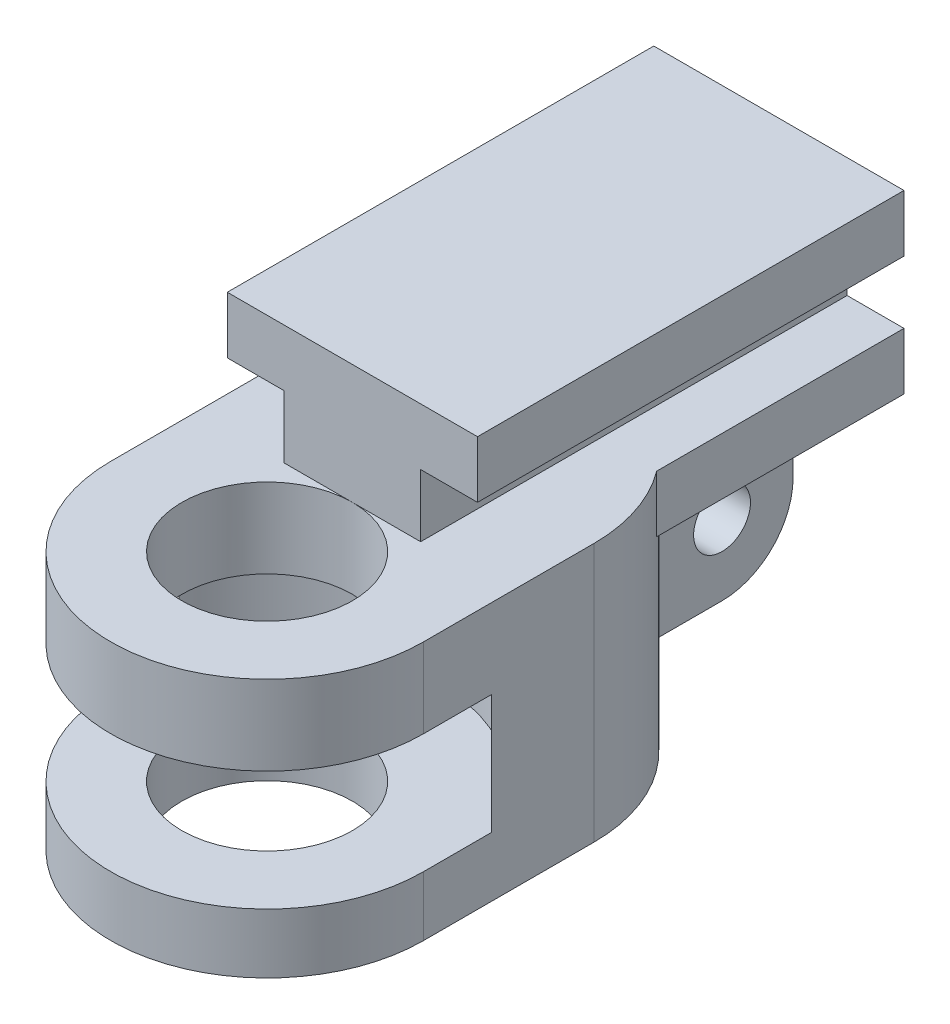
ISO-10303-21;
HEADER;
FILE_DESCRIPTION(('STEP AP214'),'2;1');
FILE_NAME('part.step','',(''),(''),'','','');
FILE_SCHEMA(('AUTOMOTIVE_DESIGN { 1 0 10303 214 1 1 1 1 }'));
ENDSEC;
DATA;
#1=APPLICATION_CONTEXT('core data for automotive mechanical design processes');
#2=APPLICATION_PROTOCOL_DEFINITION('international standard','automotive_design',2000,#1);
#3=PRODUCT_CONTEXT('',#1,'mechanical');
#4=PRODUCT('Part','Part','',(#3));
#5=PRODUCT_RELATED_PRODUCT_CATEGORY('part','',(#4));
#6=PRODUCT_DEFINITION_FORMATION('','',#4);
#7=PRODUCT_DEFINITION_CONTEXT('part definition',#1,'design');
#8=PRODUCT_DEFINITION('design','',#6,#7);
#9=PRODUCT_DEFINITION_SHAPE('','',#8);
#10=(LENGTH_UNIT() NAMED_UNIT(*) SI_UNIT(.MILLI.,.METRE.));
#11=(NAMED_UNIT(*) PLANE_ANGLE_UNIT() SI_UNIT($,.RADIAN.));
#12=(NAMED_UNIT(*) SI_UNIT($,.STERADIAN.) SOLID_ANGLE_UNIT());
#13=UNCERTAINTY_MEASURE_WITH_UNIT(LENGTH_MEASURE(1.E-05),#10,'distance_accuracy_value','');
#14=(GEOMETRIC_REPRESENTATION_CONTEXT(3) GLOBAL_UNCERTAINTY_ASSIGNED_CONTEXT((#13)) GLOBAL_UNIT_ASSIGNED_CONTEXT((#10,
#11,#12)) REPRESENTATION_CONTEXT('',''));
#15=CARTESIAN_POINT('',(0.,0.,0.));
#16=DIRECTION('',(0.,0.,1.));
#17=DIRECTION('',(1.,0.,0.));
#18=AXIS2_PLACEMENT_3D('',#15,#16,#17);
#19=CARTESIAN_POINT('',(-4.4,-3.1,15.));
#20=DIRECTION('',(0.,1.,0.));
#21=DIRECTION('',(0.,0.,1.));
#22=AXIS2_PLACEMENT_3D('',#19,#20,#21);
#23=PLANE('',#22);
#24=DIRECTION('',(0.,0.,1.));
#25=VECTOR('',#24,1.);
#26=CARTESIAN_POINT('',(-1.5,-3.1,9.5));
#27=LINE('',#26,#25);
#28=CARTESIAN_POINT('',(-1.5,-3.1,0.999999999999999));
#29=VERTEX_POINT('',#28);
#30=CARTESIAN_POINT('',(-1.5,-3.1,6.70849737787082));
#31=VERTEX_POINT('',#30);
#32=EDGE_CURVE('E245',#29,#31,#27,.T.);
#33=ORIENTED_EDGE('',*,*,#32,.T.);
#34=CARTESIAN_POINT('',(0.,-3.1,12.));
#35=DIRECTION('',(0.,1.,0.));
#36=DIRECTION('',(0.,0.,1.));
#37=AXIS2_PLACEMENT_3D('',#34,#35,#36);
#38=CIRCLE('',#37,5.5);
#39=CARTESIAN_POINT('',(-4.4,-3.1,8.7));
#40=VERTEX_POINT('',#39);
#41=EDGE_CURVE('E322',#31,#40,#38,.T.);
#42=ORIENTED_EDGE('',*,*,#41,.T.);
#43=DIRECTION('',(0.,0.,-1.));
#44=VECTOR('',#43,1.);
#45=CARTESIAN_POINT('',(-4.4,-3.1,15.));
#46=LINE('',#45,#44);
#47=CARTESIAN_POINT('',(-4.4,-3.1,0.));
#48=VERTEX_POINT('',#47);
#49=EDGE_CURVE('E385',#40,#48,#46,.T.);
#50=ORIENTED_EDGE('',*,*,#49,.T.);
#51=DIRECTION('',(1.,0.,0.));
#52=VECTOR('',#51,1.);
#53=CARTESIAN_POINT('',(-4.4,-3.1,0.));
#54=LINE('',#53,#52);
#55=CARTESIAN_POINT('',(4.4,-3.1,0.));
#56=VERTEX_POINT('',#55);
#57=EDGE_CURVE('E362',#48,#56,#54,.T.);
#58=ORIENTED_EDGE('',*,*,#57,.T.);
#59=DIRECTION('',(0.,0.,-1.));
#60=VECTOR('',#59,1.);
#61=CARTESIAN_POINT('',(4.4,-3.1,15.));
#62=LINE('',#61,#60);
#63=CARTESIAN_POINT('',(4.4,-3.1,8.7));
#64=VERTEX_POINT('',#63);
#65=EDGE_CURVE('E383',#64,#56,#62,.T.);
#66=ORIENTED_EDGE('',*,*,#65,.F.);
#67=CARTESIAN_POINT('',(1.5,-3.1,6.70849737787082));
#68=VERTEX_POINT('',#67);
#69=EDGE_CURVE('E323',#64,#68,#38,.T.);
#70=ORIENTED_EDGE('',*,*,#69,.T.);
#71=DIRECTION('',(0.,0.,1.));
#72=VECTOR('',#71,1.);
#73=CARTESIAN_POINT('',(1.5,-3.1,9.5));
#74=LINE('',#73,#72);
#75=CARTESIAN_POINT('',(1.5,-3.1,0.999999999999997));
#76=VERTEX_POINT('',#75);
#77=EDGE_CURVE('E60',#76,#68,#74,.T.);
#78=ORIENTED_EDGE('',*,*,#77,.F.);
#79=DIRECTION('',(1.,0.,0.));
#80=VECTOR('',#79,1.);
#81=CARTESIAN_POINT('',(-1.5,-3.1,0.999999999999999));
#82=LINE('',#81,#80);
#83=EDGE_CURVE('E55',#29,#76,#82,.T.);
#84=ORIENTED_EDGE('',*,*,#83,.F.);
#85=EDGE_LOOP('',(#33,#42,#50,#58,#66,#70,#78,#84));
#86=FACE_BOUND('',#85,.T.);
#87=ADVANCED_FACE('F40',(#86),#23,.F.);
#88=CARTESIAN_POINT('',(0.,-10.2,12.));
#89=DIRECTION('',(0.,1.,0.));
#90=DIRECTION('',(-1.,0.,0.));
#91=AXIS2_PLACEMENT_3D('',#88,#89,#90);
#92=CYLINDRICAL_SURFACE('',#91,5.5);
#93=ORIENTED_EDGE('',*,*,#41,.F.);
#94=DIRECTION('',(0.,1.,0.));
#95=VECTOR('',#94,1.);
#96=CARTESIAN_POINT('',(-1.5,-10.2,6.70849737787082));
#97=LINE('',#96,#95);
#98=CARTESIAN_POINT('',(-1.5,-9.1,6.70849737787082));
#99=VERTEX_POINT('',#98);
#100=EDGE_CURVE('E11',#31,#99,#97,.F.);
#101=ORIENTED_EDGE('',*,*,#100,.T.);
#102=CARTESIAN_POINT('',(0.,-9.1,12.));
#103=DIRECTION('',(0.,-1.,0.));
#104=DIRECTION('',(0.,0.,-1.));
#105=AXIS2_PLACEMENT_3D('',#102,#103,#104);
#106=CIRCLE('',#105,5.5);
#107=CARTESIAN_POINT('',(1.5,-9.1,6.70849737787082));
#108=VERTEX_POINT('',#107);
#109=EDGE_CURVE('E48',#108,#99,#106,.F.);
#110=ORIENTED_EDGE('',*,*,#109,.F.);
#111=DIRECTION('',(0.,1.,0.));
#112=VECTOR('',#111,1.);
#113=CARTESIAN_POINT('',(1.5,-10.2,6.70849737787082));
#114=LINE('',#113,#112);
#115=EDGE_CURVE('E414',#68,#108,#114,.F.);
#116=ORIENTED_EDGE('',*,*,#115,.F.);
#117=ORIENTED_EDGE('',*,*,#69,.F.);
#118=DIRECTION('',(0.,1.,0.));
#119=VECTOR('',#118,1.);
#120=CARTESIAN_POINT('',(4.4,-10.2,8.7));
#121=LINE('',#120,#119);
#122=CARTESIAN_POINT('',(4.4,-1.1,8.7));
#123=VERTEX_POINT('',#122);
#124=EDGE_CURVE('E310',#123,#64,#121,.F.);
#125=ORIENTED_EDGE('',*,*,#124,.F.);
#126=CARTESIAN_POINT('',(0.,-1.1,12.));
#127=DIRECTION('',(0.,1.,0.));
#128=DIRECTION('',(-1.,0.,0.));
#129=AXIS2_PLACEMENT_3D('',#126,#127,#128);
#130=CIRCLE('',#129,5.5);
#131=CARTESIAN_POINT('',(5.5,-1.1,12.));
#132=VERTEX_POINT('',#131);
#133=EDGE_CURVE('E297',#132,#123,#130,.T.);
#134=ORIENTED_EDGE('',*,*,#133,.F.);
#135=DIRECTION('',(0.,1.,0.));
#136=VECTOR('',#135,1.);
#137=CARTESIAN_POINT('',(5.5,-10.2,12.));
#138=LINE('',#137,#136);
#139=CARTESIAN_POINT('',(5.5,-10.2,12.));
#140=VERTEX_POINT('',#139);
#141=EDGE_CURVE('E308',#140,#132,#138,.T.);
#142=ORIENTED_EDGE('',*,*,#141,.F.);
#143=CARTESIAN_POINT('',(0.,-10.2,12.));
#144=DIRECTION('',(0.,1.,0.));
#145=DIRECTION('',(-1.,0.,0.));
#146=AXIS2_PLACEMENT_3D('',#143,#144,#145);
#147=CIRCLE('',#146,5.5);
#148=CARTESIAN_POINT('',(-5.5,-10.2,12.));
#149=VERTEX_POINT('',#148);
#150=EDGE_CURVE('E283',#140,#149,#147,.T.);
#151=ORIENTED_EDGE('',*,*,#150,.T.);
#152=DIRECTION('',(0.,1.,0.));
#153=VECTOR('',#152,1.);
#154=CARTESIAN_POINT('',(-5.5,-10.2,12.));
#155=LINE('',#154,#153);
#156=CARTESIAN_POINT('',(-5.5,-1.1,12.));
#157=VERTEX_POINT('',#156);
#158=EDGE_CURVE('E296',#149,#157,#155,.T.);
#159=ORIENTED_EDGE('',*,*,#158,.T.);
#160=CARTESIAN_POINT('',(-4.4,-1.1,8.7));
#161=VERTEX_POINT('',#160);
#162=EDGE_CURVE('E280',#161,#157,#130,.T.);
#163=ORIENTED_EDGE('',*,*,#162,.F.);
#164=DIRECTION('',(0.,1.,0.));
#165=VECTOR('',#164,1.);
#166=CARTESIAN_POINT('',(-4.4,-10.2,8.70000000000001));
#167=LINE('',#166,#165);
#168=EDGE_CURVE('E325',#40,#161,#167,.T.);
#169=ORIENTED_EDGE('',*,*,#168,.F.);
#170=EDGE_LOOP('',(#93,#101,#110,#116,#117,#125,#134,#142,#151,#159,#163,#169));
#171=FACE_BOUND('',#170,.T.);
#172=ADVANCED_FACE('F427',(#171),#92,.T.);
#173=CARTESIAN_POINT('',(5.5,-10.2,18.));
#174=DIRECTION('',(1.,0.,0.));
#175=DIRECTION('',(0.,1.,0.));
#176=AXIS2_PLACEMENT_3D('',#173,#174,#175);
#177=PLANE('',#176);
#178=DIRECTION('',(0.,1.,0.));
#179=VECTOR('',#178,1.);
#180=CARTESIAN_POINT('',(5.5,-10.2,18.));
#181=LINE('',#180,#179);
#182=CARTESIAN_POINT('',(5.5,-3.9,18.));
#183=VERTEX_POINT('',#182);
#184=CARTESIAN_POINT('',(5.5,-1.1,18.));
#185=VERTEX_POINT('',#184);
#186=EDGE_CURVE('E314',#183,#185,#181,.T.);
#187=ORIENTED_EDGE('',*,*,#186,.F.);
#188=DIRECTION('',(0.,0.,-1.));
#189=VECTOR('',#188,1.);
#190=CARTESIAN_POINT('',(5.5,-3.9,18.));
#191=LINE('',#190,#189);
#192=CARTESIAN_POINT('',(5.5,-3.9,15.6020842383436));
#193=VERTEX_POINT('',#192);
#194=EDGE_CURVE('E271',#183,#193,#191,.T.);
#195=ORIENTED_EDGE('',*,*,#194,.T.);
#196=DIRECTION('',(0.,-1.,0.));
#197=VECTOR('',#196,1.);
#198=CARTESIAN_POINT('',(5.5,-3.9,15.6020842383436));
#199=LINE('',#198,#197);
#200=CARTESIAN_POINT('',(5.5,-8.1,15.6020842383436));
#201=VERTEX_POINT('',#200);
#202=EDGE_CURVE('E274',#201,#193,#199,.F.);
#203=ORIENTED_EDGE('',*,*,#202,.F.);
#204=DIRECTION('',(0.,0.,-1.));
#205=VECTOR('',#204,1.);
#206=CARTESIAN_POINT('',(5.5,-8.1,18.));
#207=LINE('',#206,#205);
#208=CARTESIAN_POINT('',(5.5,-8.1,18.));
#209=VERTEX_POINT('',#208);
#210=EDGE_CURVE('E262',#209,#201,#207,.T.);
#211=ORIENTED_EDGE('',*,*,#210,.F.);
#212=CARTESIAN_POINT('',(5.5,-10.2,18.));
#213=VERTEX_POINT('',#212);
#214=EDGE_CURVE('E311',#213,#209,#181,.T.);
#215=ORIENTED_EDGE('',*,*,#214,.F.);
#216=DIRECTION('',(0.,0.,-1.));
#217=VECTOR('',#216,1.);
#218=CARTESIAN_POINT('',(5.5,-10.2,18.));
#219=LINE('',#218,#217);
#220=EDGE_CURVE('E293',#213,#140,#219,.T.);
#221=ORIENTED_EDGE('',*,*,#220,.T.);
#222=ORIENTED_EDGE('',*,*,#141,.T.);
#223=DIRECTION('',(0.,0.,-1.));
#224=VECTOR('',#223,1.);
#225=CARTESIAN_POINT('',(5.5,-1.1,18.));
#226=LINE('',#225,#224);
#227=EDGE_CURVE('E287',#185,#132,#226,.T.);
#228=ORIENTED_EDGE('',*,*,#227,.F.);
#229=EDGE_LOOP('',(#187,#195,#203,#211,#215,#221,#222,#228));
#230=FACE_BOUND('',#229,.T.);
#231=ADVANCED_FACE('F454',(#230),#177,.T.);
#232=CARTESIAN_POINT('',(0.,-10.2,18.));
#233=DIRECTION('',(0.,1.,0.));
#234=DIRECTION('',(-1.,0.,0.));
#235=AXIS2_PLACEMENT_3D('',#232,#233,#234);
#236=CYLINDRICAL_SURFACE('',#235,5.5);
#237=DIRECTION('',(0.,1.,0.));
#238=VECTOR('',#237,1.);
#239=CARTESIAN_POINT('',(-5.5,-10.2,18.));
#240=LINE('',#239,#238);
#241=CARTESIAN_POINT('',(-5.5,-3.9,18.));
#242=VERTEX_POINT('',#241);
#243=CARTESIAN_POINT('',(-5.5,-1.1,18.));
#244=VERTEX_POINT('',#243);
#245=EDGE_CURVE('E318',#242,#244,#240,.T.);
#246=ORIENTED_EDGE('',*,*,#245,.F.);
#247=CARTESIAN_POINT('',(0.,-3.9,18.));
#248=DIRECTION('',(0.,-1.,0.));
#249=DIRECTION('',(1.,0.,0.));
#250=AXIS2_PLACEMENT_3D('',#247,#248,#249);
#251=CIRCLE('',#250,5.5);
#252=EDGE_CURVE('E268',#242,#183,#251,.F.);
#253=ORIENTED_EDGE('',*,*,#252,.T.);
#254=ORIENTED_EDGE('',*,*,#186,.T.);
#255=CARTESIAN_POINT('',(0.,-1.1,18.));
#256=DIRECTION('',(0.,1.,0.));
#257=DIRECTION('',(-1.,0.,0.));
#258=AXIS2_PLACEMENT_3D('',#255,#256,#257);
#259=CIRCLE('',#258,5.5);
#260=EDGE_CURVE('E303',#244,#185,#259,.T.);
#261=ORIENTED_EDGE('',*,*,#260,.F.);
#262=EDGE_LOOP('',(#246,#253,#254,#261));
#263=FACE_BOUND('',#262,.T.);
#264=ADVANCED_FACE('F468',(#263),#236,.T.);
#265=CARTESIAN_POINT('',(-5.5,-10.2,18.));
#266=DIRECTION('',(-1.,0.,0.));
#267=DIRECTION('',(0.,-1.,0.));
#268=AXIS2_PLACEMENT_3D('',#265,#266,#267);
#269=PLANE('',#268);
#270=DIRECTION('',(0.,-1.,0.));
#271=VECTOR('',#270,1.);
#272=CARTESIAN_POINT('',(-5.5,-3.9,15.6020842383436));
#273=LINE('',#272,#271);
#274=CARTESIAN_POINT('',(-5.5,-3.9,15.6020842383436));
#275=VERTEX_POINT('',#274);
#276=CARTESIAN_POINT('',(-5.5,-8.1,15.6020842383436));
#277=VERTEX_POINT('',#276);
#278=EDGE_CURVE('E411',#275,#277,#273,.T.);
#279=ORIENTED_EDGE('',*,*,#278,.F.);
#280=DIRECTION('',(0.,0.,1.));
#281=VECTOR('',#280,1.);
#282=CARTESIAN_POINT('',(-5.5,-3.9,18.));
#283=LINE('',#282,#281);
#284=EDGE_CURVE('E265',#275,#242,#283,.T.);
#285=ORIENTED_EDGE('',*,*,#284,.T.);
#286=ORIENTED_EDGE('',*,*,#245,.T.);
#287=DIRECTION('',(0.,0.,1.));
#288=VECTOR('',#287,1.);
#289=CARTESIAN_POINT('',(-5.5,-1.1,18.));
#290=LINE('',#289,#288);
#291=EDGE_CURVE('E300',#157,#244,#290,.T.);
#292=ORIENTED_EDGE('',*,*,#291,.F.);
#293=ORIENTED_EDGE('',*,*,#158,.F.);
#294=DIRECTION('',(0.,0.,1.));
#295=VECTOR('',#294,1.);
#296=CARTESIAN_POINT('',(-5.5,-10.2,18.));
#297=LINE('',#296,#295);
#298=CARTESIAN_POINT('',(-5.5,-10.2,18.));
#299=VERTEX_POINT('',#298);
#300=EDGE_CURVE('E286',#149,#299,#297,.T.);
#301=ORIENTED_EDGE('',*,*,#300,.T.);
#302=CARTESIAN_POINT('',(-5.5,-8.1,18.));
#303=VERTEX_POINT('',#302);
#304=EDGE_CURVE('E315',#299,#303,#240,.T.);
#305=ORIENTED_EDGE('',*,*,#304,.T.);
#306=DIRECTION('',(0.,0.,1.));
#307=VECTOR('',#306,1.);
#308=CARTESIAN_POINT('',(-5.5,-8.1,18.));
#309=LINE('',#308,#307);
#310=EDGE_CURVE('E258',#277,#303,#309,.T.);
#311=ORIENTED_EDGE('',*,*,#310,.F.);
#312=EDGE_LOOP('',(#279,#285,#286,#292,#293,#301,#305,#311));
#313=FACE_BOUND('',#312,.T.);
#314=ADVANCED_FACE('F463',(#313),#269,.T.);
#315=CARTESIAN_POINT('',(0.,-10.2,18.));
#316=DIRECTION('',(0.,1.,0.));
#317=DIRECTION('',(-1.,0.,0.));
#318=AXIS2_PLACEMENT_3D('',#315,#316,#317);
#319=CYLINDRICAL_SURFACE('',#318,3.);
#320=CARTESIAN_POINT('',(0.,-1.1,18.));
#321=DIRECTION('',(0.,1.,0.));
#322=DIRECTION('',(-1.,0.,0.));
#323=AXIS2_PLACEMENT_3D('',#320,#321,#322);
#324=CIRCLE('',#323,3.);
#325=CARTESIAN_POINT('',(0.,-1.1,15.));
#326=VERTEX_POINT('',#325);
#327=EDGE_CURVE('E276',#326,#326,#324,.T.);
#328=ORIENTED_EDGE('',*,*,#327,.T.);
#329=EDGE_LOOP('',(#328));
#330=FACE_BOUND('',#329,.T.);
#331=CARTESIAN_POINT('',(0.,-3.9,18.));
#332=DIRECTION('',(0.,-1.,0.));
#333=DIRECTION('',(1.,0.,0.));
#334=AXIS2_PLACEMENT_3D('',#331,#332,#333);
#335=CIRCLE('',#334,3.);
#336=CARTESIAN_POINT('',(3.,-3.9,18.));
#337=VERTEX_POINT('',#336);
#338=EDGE_CURVE('E264',#337,#337,#335,.F.);
#339=ORIENTED_EDGE('',*,*,#338,.F.);
#340=EDGE_LOOP('',(#339));
#341=FACE_BOUND('',#340,.T.);
#342=ADVANCED_FACE('F526',(#330,#341),#319,.F.);
#343=CARTESIAN_POINT('',(4.4,1.1,15.));
#344=DIRECTION('',(-1.,0.,0.));
#345=DIRECTION('',(0.,0.,1.));
#346=AXIS2_PLACEMENT_3D('',#343,#344,#345);
#347=PLANE('',#346);
#348=DIRECTION('',(0.,1.,0.));
#349=VECTOR('',#348,1.);
#350=CARTESIAN_POINT('',(4.4,1.1,0.));
#351=LINE('',#350,#349);
#352=CARTESIAN_POINT('',(4.4,1.1,0.));
#353=VERTEX_POINT('',#352);
#354=CARTESIAN_POINT('',(4.4,3.1,0.));
#355=VERTEX_POINT('',#354);
#356=EDGE_CURVE('E327',#353,#355,#351,.T.);
#357=ORIENTED_EDGE('',*,*,#356,.T.);
#358=DIRECTION('',(0.,0.,-1.));
#359=VECTOR('',#358,1.);
#360=CARTESIAN_POINT('',(4.4,3.1,15.));
#361=LINE('',#360,#359);
#362=CARTESIAN_POINT('',(4.4,3.1,15.));
#363=VERTEX_POINT('',#362);
#364=EDGE_CURVE('E400',#363,#355,#361,.T.);
#365=ORIENTED_EDGE('',*,*,#364,.F.);
#366=DIRECTION('',(0.,1.,0.));
#367=VECTOR('',#366,1.);
#368=CARTESIAN_POINT('',(4.4,1.1,15.));
#369=LINE('',#368,#367);
#370=CARTESIAN_POINT('',(4.4,1.1,15.));
#371=VERTEX_POINT('',#370);
#372=EDGE_CURVE('E328',#371,#363,#369,.T.);
#373=ORIENTED_EDGE('',*,*,#372,.F.);
#374=DIRECTION('',(0.,0.,-1.));
#375=VECTOR('',#374,1.);
#376=CARTESIAN_POINT('',(4.4,1.1,15.));
#377=LINE('',#376,#375);
#378=EDGE_CURVE('E344',#371,#353,#377,.T.);
#379=ORIENTED_EDGE('',*,*,#378,.T.);
#380=EDGE_LOOP('',(#357,#365,#373,#379));
#381=FACE_BOUND('',#380,.T.);
#382=ADVANCED_FACE('F42',(#381),#347,.F.);
#383=CARTESIAN_POINT('',(-4.4,3.1,15.));
#384=DIRECTION('',(0.,-1.,0.));
#385=DIRECTION('',(0.,0.,-1.));
#386=AXIS2_PLACEMENT_3D('',#383,#384,#385);
#387=PLANE('',#386);
#388=DIRECTION('',(-1.,0.,0.));
#389=VECTOR('',#388,1.);
#390=CARTESIAN_POINT('',(-4.4,3.1,0.));
#391=LINE('',#390,#389);
#392=CARTESIAN_POINT('',(-4.4,3.1,0.));
#393=VERTEX_POINT('',#392);
#394=EDGE_CURVE('E347',#355,#393,#391,.T.);
#395=ORIENTED_EDGE('',*,*,#394,.T.);
#396=DIRECTION('',(0.,0.,-1.));
#397=VECTOR('',#396,1.);
#398=CARTESIAN_POINT('',(-4.4,3.1,15.));
#399=LINE('',#398,#397);
#400=CARTESIAN_POINT('',(-4.4,3.1,15.));
#401=VERTEX_POINT('',#400);
#402=EDGE_CURVE('E397',#401,#393,#399,.T.);
#403=ORIENTED_EDGE('',*,*,#402,.F.);
#404=DIRECTION('',(-1.,0.,0.));
#405=VECTOR('',#404,1.);
#406=CARTESIAN_POINT('',(-4.4,3.1,15.));
#407=LINE('',#406,#405);
#408=EDGE_CURVE('E331',#363,#401,#407,.T.);
#409=ORIENTED_EDGE('',*,*,#408,.F.);
#410=ORIENTED_EDGE('',*,*,#364,.T.);
#411=EDGE_LOOP('',(#395,#403,#409,#410));
#412=FACE_BOUND('',#411,.T.);
#413=ADVANCED_FACE('F519',(#412),#387,.F.);
#414=CARTESIAN_POINT('',(-4.4,1.1,15.));
#415=DIRECTION('',(1.,0.,0.));
#416=DIRECTION('',(0.,0.,-1.));
#417=AXIS2_PLACEMENT_3D('',#414,#415,#416);
#418=PLANE('',#417);
#419=DIRECTION('',(0.,-1.,0.));
#420=VECTOR('',#419,1.);
#421=CARTESIAN_POINT('',(-4.4,1.1,0.));
#422=LINE('',#421,#420);
#423=CARTESIAN_POINT('',(-4.4,1.1,0.));
#424=VERTEX_POINT('',#423);
#425=EDGE_CURVE('E349',#393,#424,#422,.T.);
#426=ORIENTED_EDGE('',*,*,#425,.T.);
#427=DIRECTION('',(0.,0.,-1.));
#428=VECTOR('',#427,1.);
#429=CARTESIAN_POINT('',(-4.4,1.1,15.));
#430=LINE('',#429,#428);
#431=CARTESIAN_POINT('',(-4.4,1.1,15.));
#432=VERTEX_POINT('',#431);
#433=EDGE_CURVE('E394',#432,#424,#430,.T.);
#434=ORIENTED_EDGE('',*,*,#433,.F.);
#435=DIRECTION('',(0.,-1.,0.));
#436=VECTOR('',#435,1.);
#437=CARTESIAN_POINT('',(-4.4,1.1,15.));
#438=LINE('',#437,#436);
#439=EDGE_CURVE('E334',#401,#432,#438,.T.);
#440=ORIENTED_EDGE('',*,*,#439,.F.);
#441=ORIENTED_EDGE('',*,*,#402,.T.);
#442=EDGE_LOOP('',(#426,#434,#440,#441));
#443=FACE_BOUND('',#442,.T.);
#444=ADVANCED_FACE('F516',(#443),#418,.F.);
#445=CARTESIAN_POINT('',(-2.4,1.1,15.));
#446=DIRECTION('',(0.,1.,0.));
#447=DIRECTION('',(-1.,0.,0.));
#448=AXIS2_PLACEMENT_3D('',#445,#446,#447);
#449=PLANE('',#448);
#450=DIRECTION('',(1.,0.,0.));
#451=VECTOR('',#450,1.);
#452=CARTESIAN_POINT('',(-2.4,1.1,0.));
#453=LINE('',#452,#451);
#454=CARTESIAN_POINT('',(-2.4,1.1,0.));
#455=VERTEX_POINT('',#454);
#456=EDGE_CURVE('E351',#424,#455,#453,.T.);
#457=ORIENTED_EDGE('',*,*,#456,.T.);
#458=DIRECTION('',(0.,0.,-1.));
#459=VECTOR('',#458,1.);
#460=CARTESIAN_POINT('',(-2.4,1.1,15.));
#461=LINE('',#460,#459);
#462=CARTESIAN_POINT('',(-2.4,1.1,15.));
#463=VERTEX_POINT('',#462);
#464=EDGE_CURVE('E391',#463,#455,#461,.T.);
#465=ORIENTED_EDGE('',*,*,#464,.F.);
#466=DIRECTION('',(1.,0.,0.));
#467=VECTOR('',#466,1.);
#468=CARTESIAN_POINT('',(-2.4,1.1,15.));
#469=LINE('',#468,#467);
#470=EDGE_CURVE('E336',#432,#463,#469,.T.);
#471=ORIENTED_EDGE('',*,*,#470,.F.);
#472=ORIENTED_EDGE('',*,*,#433,.T.);
#473=EDGE_LOOP('',(#457,#465,#471,#472));
#474=FACE_BOUND('',#473,.T.);
#475=ADVANCED_FACE('F512',(#474),#449,.F.);
#476=CARTESIAN_POINT('',(-2.4,-1.1,15.));
#477=DIRECTION('',(1.,0.,0.));
#478=DIRECTION('',(0.,1.,0.));
#479=AXIS2_PLACEMENT_3D('',#476,#477,#478);
#480=PLANE('',#479);
#481=DIRECTION('',(0.,-1.,0.));
#482=VECTOR('',#481,1.);
#483=CARTESIAN_POINT('',(-2.4,-1.1,0.));
#484=LINE('',#483,#482);
#485=CARTESIAN_POINT('',(-2.4,-1.1,0.));
#486=VERTEX_POINT('',#485);
#487=EDGE_CURVE('E353',#455,#486,#484,.T.);
#488=ORIENTED_EDGE('',*,*,#487,.T.);
#489=DIRECTION('',(0.,0.,-1.));
#490=VECTOR('',#489,1.);
#491=CARTESIAN_POINT('',(-2.4,-1.1,15.));
#492=LINE('',#491,#490);
#493=CARTESIAN_POINT('',(-2.4,-1.1,15.));
#494=VERTEX_POINT('',#493);
#495=EDGE_CURVE('E389',#494,#486,#492,.T.);
#496=ORIENTED_EDGE('',*,*,#495,.F.);
#497=DIRECTION('',(0.,-1.,0.));
#498=VECTOR('',#497,1.);
#499=CARTESIAN_POINT('',(-2.4,-1.1,15.));
#500=LINE('',#499,#498);
#501=EDGE_CURVE('E338',#463,#494,#500,.T.);
#502=ORIENTED_EDGE('',*,*,#501,.F.);
#503=ORIENTED_EDGE('',*,*,#464,.T.);
#504=EDGE_LOOP('',(#488,#496,#502,#503));
#505=FACE_BOUND('',#504,.T.);
#506=ADVANCED_FACE('F509',(#505),#480,.F.);
#507=CARTESIAN_POINT('',(-4.4,-1.1,15.));
#508=DIRECTION('',(1.,0.,0.));
#509=DIRECTION('',(0.,1.,0.));
#510=AXIS2_PLACEMENT_3D('',#507,#508,#509);
#511=PLANE('',#510);
#512=ORIENTED_EDGE('',*,*,#49,.F.);
#513=ORIENTED_EDGE('',*,*,#168,.T.);
#514=DIRECTION('',(0.,0.,-1.));
#515=VECTOR('',#514,1.);
#516=CARTESIAN_POINT('',(-4.4,-1.1,15.));
#517=LINE('',#516,#515);
#518=CARTESIAN_POINT('',(-4.4,-1.1,0.));
#519=VERTEX_POINT('',#518);
#520=EDGE_CURVE('E387',#161,#519,#517,.T.);
#521=ORIENTED_EDGE('',*,*,#520,.T.);
#522=DIRECTION('',(0.,-1.,0.));
#523=VECTOR('',#522,1.);
#524=CARTESIAN_POINT('',(-4.4,-1.1,0.));
#525=LINE('',#524,#523);
#526=EDGE_CURVE('E359',#519,#48,#525,.T.);
#527=ORIENTED_EDGE('',*,*,#526,.T.);
#528=EDGE_LOOP('',(#512,#513,#521,#527));
#529=FACE_BOUND('',#528,.T.);
#530=ADVANCED_FACE('F431',(#529),#511,.F.);
#531=CARTESIAN_POINT('',(4.4,-1.1,15.));
#532=DIRECTION('',(-1.,0.,0.));
#533=DIRECTION('',(0.,-1.,0.));
#534=AXIS2_PLACEMENT_3D('',#531,#532,#533);
#535=PLANE('',#534);
#536=DIRECTION('',(0.,0.,-1.));
#537=VECTOR('',#536,1.);
#538=CARTESIAN_POINT('',(4.4,-1.1,15.));
#539=LINE('',#538,#537);
#540=CARTESIAN_POINT('',(4.4,-1.1,0.));
#541=VERTEX_POINT('',#540);
#542=EDGE_CURVE('E381',#123,#541,#539,.T.);
#543=ORIENTED_EDGE('',*,*,#542,.F.);
#544=ORIENTED_EDGE('',*,*,#124,.T.);
#545=ORIENTED_EDGE('',*,*,#65,.T.);
#546=DIRECTION('',(0.,1.,0.));
#547=VECTOR('',#546,1.);
#548=CARTESIAN_POINT('',(4.4,-1.1,0.));
#549=LINE('',#548,#547);
#550=EDGE_CURVE('E365',#56,#541,#549,.T.);
#551=ORIENTED_EDGE('',*,*,#550,.T.);
#552=EDGE_LOOP('',(#543,#544,#545,#551));
#553=FACE_BOUND('',#552,.T.);
#554=ADVANCED_FACE('F505',(#553),#535,.F.);
#555=CARTESIAN_POINT('',(2.4,-1.1,15.));
#556=DIRECTION('',(0.,-1.,0.));
#557=DIRECTION('',(1.,0.,0.));
#558=AXIS2_PLACEMENT_3D('',#555,#556,#557);
#559=PLANE('',#558);
#560=ORIENTED_EDGE('',*,*,#495,.T.);
#561=DIRECTION('',(-1.,0.,0.));
#562=VECTOR('',#561,1.);
#563=CARTESIAN_POINT('',(-2.4,-1.1,0.));
#564=LINE('',#563,#562);
#565=EDGE_CURVE('E356',#486,#519,#564,.T.);
#566=ORIENTED_EDGE('',*,*,#565,.T.);
#567=ORIENTED_EDGE('',*,*,#520,.F.);
#568=ORIENTED_EDGE('',*,*,#162,.T.);
#569=ORIENTED_EDGE('',*,*,#291,.T.);
#570=ORIENTED_EDGE('',*,*,#260,.T.);
#571=ORIENTED_EDGE('',*,*,#227,.T.);
#572=ORIENTED_EDGE('',*,*,#133,.T.);
#573=ORIENTED_EDGE('',*,*,#542,.T.);
#574=DIRECTION('',(-1.,0.,0.));
#575=VECTOR('',#574,1.);
#576=CARTESIAN_POINT('',(2.4,-1.1,0.));
#577=LINE('',#576,#575);
#578=CARTESIAN_POINT('',(2.4,-1.1,0.));
#579=VERTEX_POINT('',#578);
#580=EDGE_CURVE('E368',#541,#579,#577,.T.);
#581=ORIENTED_EDGE('',*,*,#580,.T.);
#582=DIRECTION('',(0.,0.,-1.));
#583=VECTOR('',#582,1.);
#584=CARTESIAN_POINT('',(2.4,-1.1,15.));
#585=LINE('',#584,#583);
#586=CARTESIAN_POINT('',(2.4,-1.1,15.));
#587=VERTEX_POINT('',#586);
#588=EDGE_CURVE('E379',#587,#579,#585,.T.);
#589=ORIENTED_EDGE('',*,*,#588,.F.);
#590=DIRECTION('',(1.,0.,0.));
#591=VECTOR('',#590,1.);
#592=CARTESIAN_POINT('',(0.,-1.1,15.));
#593=LINE('',#592,#591);
#594=EDGE_CURVE('E403',#326,#587,#593,.T.);
#595=ORIENTED_EDGE('',*,*,#594,.F.);
#596=ORIENTED_EDGE('',*,*,#327,.F.);
#597=EDGE_CURVE('E406',#494,#326,#593,.T.);
#598=ORIENTED_EDGE('',*,*,#597,.F.);
#599=EDGE_LOOP('',(#560,#566,#567,#568,#569,#570,#571,#572,#573,#581,#589,#595,#596,#598));
#600=FACE_BOUND('',#599,.T.);
#601=ADVANCED_FACE('F433',(#600),#559,.F.);
#602=CARTESIAN_POINT('',(2.4,-1.1,15.));
#603=DIRECTION('',(-1.,0.,0.));
#604=DIRECTION('',(0.,-1.,0.));
#605=AXIS2_PLACEMENT_3D('',#602,#603,#604);
#606=PLANE('',#605);
#607=DIRECTION('',(0.,1.,0.));
#608=VECTOR('',#607,1.);
#609=CARTESIAN_POINT('',(2.4,-1.1,0.));
#610=LINE('',#609,#608);
#611=CARTESIAN_POINT('',(2.4,1.1,0.));
#612=VERTEX_POINT('',#611);
#613=EDGE_CURVE('E371',#579,#612,#610,.T.);
#614=ORIENTED_EDGE('',*,*,#613,.T.);
#615=DIRECTION('',(0.,0.,-1.));
#616=VECTOR('',#615,1.);
#617=CARTESIAN_POINT('',(2.4,1.1,15.));
#618=LINE('',#617,#616);
#619=CARTESIAN_POINT('',(2.4,1.1,15.));
#620=VERTEX_POINT('',#619);
#621=EDGE_CURVE('E376',#620,#612,#618,.T.);
#622=ORIENTED_EDGE('',*,*,#621,.F.);
#623=DIRECTION('',(0.,1.,0.));
#624=VECTOR('',#623,1.);
#625=CARTESIAN_POINT('',(2.4,-1.1,15.));
#626=LINE('',#625,#624);
#627=EDGE_CURVE('E340',#587,#620,#626,.T.);
#628=ORIENTED_EDGE('',*,*,#627,.F.);
#629=ORIENTED_EDGE('',*,*,#588,.T.);
#630=EDGE_LOOP('',(#614,#622,#628,#629));
#631=FACE_BOUND('',#630,.T.);
#632=ADVANCED_FACE('F548',(#631),#606,.F.);
#633=CARTESIAN_POINT('',(2.4,1.1,15.));
#634=DIRECTION('',(0.,1.,0.));
#635=DIRECTION('',(-1.,0.,0.));
#636=AXIS2_PLACEMENT_3D('',#633,#634,#635);
#637=PLANE('',#636);
#638=DIRECTION('',(1.,0.,0.));
#639=VECTOR('',#638,1.);
#640=CARTESIAN_POINT('',(2.4,1.1,0.));
#641=LINE('',#640,#639);
#642=EDGE_CURVE('E332',#612,#353,#641,.T.);
#643=ORIENTED_EDGE('',*,*,#642,.T.);
#644=ORIENTED_EDGE('',*,*,#378,.F.);
#645=DIRECTION('',(1.,0.,0.));
#646=VECTOR('',#645,1.);
#647=CARTESIAN_POINT('',(2.4,1.1,15.));
#648=LINE('',#647,#646);
#649=EDGE_CURVE('E342',#620,#371,#648,.T.);
#650=ORIENTED_EDGE('',*,*,#649,.F.);
#651=ORIENTED_EDGE('',*,*,#621,.T.);
#652=EDGE_LOOP('',(#643,#644,#650,#651));
#653=FACE_BOUND('',#652,.T.);
#654=ADVANCED_FACE('F545',(#653),#637,.F.);
#655=CARTESIAN_POINT('',(0.,0.,15.));
#656=DIRECTION('',(0.,0.,-1.));
#657=DIRECTION('',(-1.,0.,0.));
#658=AXIS2_PLACEMENT_3D('',#655,#656,#657);
#659=PLANE('',#658);
#660=ORIENTED_EDGE('',*,*,#501,.T.);
#661=ORIENTED_EDGE('',*,*,#597,.T.);
#662=ORIENTED_EDGE('',*,*,#594,.T.);
#663=ORIENTED_EDGE('',*,*,#627,.T.);
#664=ORIENTED_EDGE('',*,*,#649,.T.);
#665=ORIENTED_EDGE('',*,*,#372,.T.);
#666=ORIENTED_EDGE('',*,*,#408,.T.);
#667=ORIENTED_EDGE('',*,*,#439,.T.);
#668=ORIENTED_EDGE('',*,*,#470,.T.);
#669=EDGE_LOOP('',(#660,#661,#662,#663,#664,#665,#666,#667,#668));
#670=FACE_BOUND('',#669,.T.);
#671=ADVANCED_FACE('F492',(#670),#659,.F.);
#672=CARTESIAN_POINT('',(0.,0.,0.));
#673=DIRECTION('',(0.,0.,-1.));
#674=DIRECTION('',(-1.,0.,0.));
#675=AXIS2_PLACEMENT_3D('',#672,#673,#674);
#676=PLANE('',#675);
#677=ORIENTED_EDGE('',*,*,#356,.F.);
#678=ORIENTED_EDGE('',*,*,#642,.F.);
#679=ORIENTED_EDGE('',*,*,#613,.F.);
#680=ORIENTED_EDGE('',*,*,#580,.F.);
#681=ORIENTED_EDGE('',*,*,#550,.F.);
#682=ORIENTED_EDGE('',*,*,#57,.F.);
#683=ORIENTED_EDGE('',*,*,#526,.F.);
#684=ORIENTED_EDGE('',*,*,#565,.F.);
#685=ORIENTED_EDGE('',*,*,#487,.F.);
#686=ORIENTED_EDGE('',*,*,#456,.F.);
#687=ORIENTED_EDGE('',*,*,#425,.F.);
#688=ORIENTED_EDGE('',*,*,#394,.F.);
#689=EDGE_LOOP('',(#677,#678,#679,#680,#681,#682,#683,#684,#685,#686,#687,#688));
#690=FACE_BOUND('',#689,.T.);
#691=ADVANCED_FACE('F442',(#690),#676,.T.);
#692=CARTESIAN_POINT('',(0.,-8.1,18.));
#693=DIRECTION('',(0.,-1.,0.));
#694=DIRECTION('',(1.,0.,0.));
#695=AXIS2_PLACEMENT_3D('',#692,#693,#694);
#696=CIRCLE('',#695,5.5);
#697=EDGE_CURVE('E260',#303,#209,#696,.F.);
#698=ORIENTED_EDGE('',*,*,#697,.F.);
#699=ORIENTED_EDGE('',*,*,#304,.F.);
#700=CARTESIAN_POINT('',(0.,-10.2,18.));
#701=DIRECTION('',(0.,1.,0.));
#702=DIRECTION('',(-1.,0.,0.));
#703=AXIS2_PLACEMENT_3D('',#700,#701,#702);
#704=CIRCLE('',#703,5.5);
#705=EDGE_CURVE('E290',#299,#213,#704,.T.);
#706=ORIENTED_EDGE('',*,*,#705,.T.);
#707=ORIENTED_EDGE('',*,*,#214,.T.);
#708=EDGE_LOOP('',(#698,#699,#706,#707));
#709=FACE_BOUND('',#708,.T.);
#710=ADVANCED_FACE('F482',(#709),#236,.T.);
#711=CARTESIAN_POINT('',(0.,-10.2,12.));
#712=DIRECTION('',(0.,1.,0.));
#713=DIRECTION('',(-1.,0.,0.));
#714=AXIS2_PLACEMENT_3D('',#711,#712,#713);
#715=PLANE('',#714);
#716=CARTESIAN_POINT('',(0.,-10.2,18.));
#717=DIRECTION('',(0.,1.,0.));
#718=DIRECTION('',(-1.,0.,0.));
#719=AXIS2_PLACEMENT_3D('',#716,#717,#718);
#720=CIRCLE('',#719,3.);
#721=CARTESIAN_POINT('',(-3.,-10.2,18.));
#722=VERTEX_POINT('',#721);
#723=EDGE_CURVE('E277',#722,#722,#720,.T.);
#724=ORIENTED_EDGE('',*,*,#723,.T.);
#725=EDGE_LOOP('',(#724));
#726=FACE_BOUND('',#725,.T.);
#727=ORIENTED_EDGE('',*,*,#150,.F.);
#728=ORIENTED_EDGE('',*,*,#220,.F.);
#729=ORIENTED_EDGE('',*,*,#705,.F.);
#730=ORIENTED_EDGE('',*,*,#300,.F.);
#731=EDGE_LOOP('',(#727,#728,#729,#730));
#732=FACE_BOUND('',#731,.T.);
#733=ADVANCED_FACE('F459',(#726,#732),#715,.F.);
#734=CARTESIAN_POINT('',(0.,-8.1,18.));
#735=DIRECTION('',(0.,-1.,0.));
#736=DIRECTION('',(1.,0.,0.));
#737=AXIS2_PLACEMENT_3D('',#734,#735,#736);
#738=CIRCLE('',#737,3.);
#739=CARTESIAN_POINT('',(3.,-8.1,18.));
#740=VERTEX_POINT('',#739);
#741=EDGE_CURVE('E255',#740,#740,#738,.F.);
#742=ORIENTED_EDGE('',*,*,#741,.T.);
#743=EDGE_LOOP('',(#742));
#744=FACE_BOUND('',#743,.T.);
#745=ORIENTED_EDGE('',*,*,#723,.F.);
#746=EDGE_LOOP('',(#745));
#747=FACE_BOUND('',#746,.T.);
#748=ADVANCED_FACE('F489',(#744,#747),#319,.F.);
#749=CARTESIAN_POINT('',(0.,-3.9,18.));
#750=DIRECTION('',(0.,-1.,0.));
#751=DIRECTION('',(1.,0.,0.));
#752=AXIS2_PLACEMENT_3D('',#749,#750,#751);
#753=PLANE('',#752);
#754=ORIENTED_EDGE('',*,*,#252,.F.);
#755=ORIENTED_EDGE('',*,*,#284,.F.);
#756=CARTESIAN_POINT('',(0.,-3.9,18.));
#757=DIRECTION('',(0.,-1.,0.));
#758=DIRECTION('',(1.,0.,0.));
#759=AXIS2_PLACEMENT_3D('',#756,#757,#758);
#760=CIRCLE('',#759,6.);
#761=EDGE_CURVE('E252',#275,#193,#760,.T.);
#762=ORIENTED_EDGE('',*,*,#761,.T.);
#763=ORIENTED_EDGE('',*,*,#194,.F.);
#764=EDGE_LOOP('',(#754,#755,#762,#763));
#765=FACE_BOUND('',#764,.T.);
#766=ORIENTED_EDGE('',*,*,#338,.T.);
#767=EDGE_LOOP('',(#766));
#768=FACE_BOUND('',#767,.T.);
#769=ADVANCED_FACE('F470',(#765,#768),#753,.T.);
#770=CARTESIAN_POINT('',(0.,-8.1,18.));
#771=DIRECTION('',(0.,-1.,0.));
#772=DIRECTION('',(1.,0.,0.));
#773=AXIS2_PLACEMENT_3D('',#770,#771,#772);
#774=PLANE('',#773);
#775=ORIENTED_EDGE('',*,*,#210,.T.);
#776=CARTESIAN_POINT('',(0.,-8.1,18.));
#777=DIRECTION('',(0.,-1.,0.));
#778=DIRECTION('',(1.,0.,0.));
#779=AXIS2_PLACEMENT_3D('',#776,#777,#778);
#780=CIRCLE('',#779,6.);
#781=EDGE_CURVE('E250',#277,#201,#780,.T.);
#782=ORIENTED_EDGE('',*,*,#781,.F.);
#783=ORIENTED_EDGE('',*,*,#310,.T.);
#784=ORIENTED_EDGE('',*,*,#697,.T.);
#785=EDGE_LOOP('',(#775,#782,#783,#784));
#786=FACE_BOUND('',#785,.T.);
#787=ORIENTED_EDGE('',*,*,#741,.F.);
#788=EDGE_LOOP('',(#787));
#789=FACE_BOUND('',#788,.T.);
#790=ADVANCED_FACE('F478',(#786,#789),#774,.F.);
#791=CARTESIAN_POINT('',(0.,-3.9,18.));
#792=DIRECTION('',(0.,-1.,0.));
#793=DIRECTION('',(1.,0.,0.));
#794=AXIS2_PLACEMENT_3D('',#791,#792,#793);
#795=CYLINDRICAL_SURFACE('',#794,6.);
#796=ORIENTED_EDGE('',*,*,#202,.T.);
#797=ORIENTED_EDGE('',*,*,#761,.F.);
#798=ORIENTED_EDGE('',*,*,#278,.T.);
#799=ORIENTED_EDGE('',*,*,#781,.T.);
#800=EDGE_LOOP('',(#796,#797,#798,#799));
#801=FACE_BOUND('',#800,.T.);
#802=ADVANCED_FACE('F476',(#801),#795,.F.);
#803=CARTESIAN_POINT('',(-1.5,-6.6,3.5));
#804=DIRECTION('',(1.,0.,0.));
#805=DIRECTION('',(0.,0.,-1.));
#806=AXIS2_PLACEMENT_3D('',#803,#804,#805);
#807=CYLINDRICAL_SURFACE('',#806,2.5);
#808=DIRECTION('',(1.,0.,0.));
#809=VECTOR('',#808,1.);
#810=CARTESIAN_POINT('',(-1.5,-6.6,0.999999999999999));
#811=LINE('',#810,#809);
#812=CARTESIAN_POINT('',(-1.5,-6.6,0.999999999999999));
#813=VERTEX_POINT('',#812);
#814=CARTESIAN_POINT('',(1.5,-6.6,0.999999999999999));
#815=VERTEX_POINT('',#814);
#816=EDGE_CURVE('E208',#813,#815,#811,.T.);
#817=ORIENTED_EDGE('',*,*,#816,.T.);
#818=CARTESIAN_POINT('',(1.5,-6.6,3.5));
#819=DIRECTION('',(1.,0.,0.));
#820=DIRECTION('',(0.,0.,-1.));
#821=AXIS2_PLACEMENT_3D('',#818,#819,#820);
#822=CIRCLE('',#821,2.5);
#823=CARTESIAN_POINT('',(1.5,-9.1,3.5));
#824=VERTEX_POINT('',#823);
#825=EDGE_CURVE('E213',#824,#815,#822,.T.);
#826=ORIENTED_EDGE('',*,*,#825,.F.);
#827=DIRECTION('',(1.,0.,0.));
#828=VECTOR('',#827,1.);
#829=CARTESIAN_POINT('',(-1.5,-9.1,3.5));
#830=LINE('',#829,#828);
#831=CARTESIAN_POINT('',(-1.5,-9.1,3.5));
#832=VERTEX_POINT('',#831);
#833=EDGE_CURVE('E248',#832,#824,#830,.T.);
#834=ORIENTED_EDGE('',*,*,#833,.F.);
#835=CARTESIAN_POINT('',(-1.5,-6.6,3.5));
#836=DIRECTION('',(1.,0.,0.));
#837=DIRECTION('',(0.,0.,-1.));
#838=AXIS2_PLACEMENT_3D('',#835,#836,#837);
#839=CIRCLE('',#838,2.5);
#840=EDGE_CURVE('E215',#832,#813,#839,.T.);
#841=ORIENTED_EDGE('',*,*,#840,.T.);
#842=EDGE_LOOP('',(#817,#826,#834,#841));
#843=FACE_BOUND('',#842,.T.);
#844=ADVANCED_FACE('F210',(#843),#807,.T.);
#845=CARTESIAN_POINT('',(-1.5,-9.1,3.5));
#846=DIRECTION('',(0.,-1.,0.));
#847=DIRECTION('',(0.,0.,-1.));
#848=AXIS2_PLACEMENT_3D('',#845,#846,#847);
#849=PLANE('',#848);
#850=DIRECTION('',(0.,0.,-1.));
#851=VECTOR('',#850,1.);
#852=CARTESIAN_POINT('',(1.5,-9.1,6.5));
#853=LINE('',#852,#851);
#854=EDGE_CURVE('E230',#108,#824,#853,.T.);
#855=ORIENTED_EDGE('',*,*,#854,.F.);
#856=ORIENTED_EDGE('',*,*,#109,.T.);
#857=DIRECTION('',(0.,0.,-1.));
#858=VECTOR('',#857,1.);
#859=CARTESIAN_POINT('',(-1.5,-9.1,6.5));
#860=LINE('',#859,#858);
#861=EDGE_CURVE('E219',#99,#832,#860,.T.);
#862=ORIENTED_EDGE('',*,*,#861,.T.);
#863=ORIENTED_EDGE('',*,*,#833,.T.);
#864=EDGE_LOOP('',(#855,#856,#862,#863));
#865=FACE_BOUND('',#864,.T.);
#866=ADVANCED_FACE('F418',(#865),#849,.T.);
#867=CARTESIAN_POINT('',(-1.5,-6.6,0.999999999999999));
#868=DIRECTION('',(0.,0.,-1.));
#869=DIRECTION('',(0.,1.,0.));
#870=AXIS2_PLACEMENT_3D('',#867,#868,#869);
#871=PLANE('',#870);
#872=ORIENTED_EDGE('',*,*,#83,.T.);
#873=DIRECTION('',(0.,1.,0.));
#874=VECTOR('',#873,1.);
#875=CARTESIAN_POINT('',(1.5,-6.6,0.999999999999999));
#876=LINE('',#875,#874);
#877=EDGE_CURVE('E222',#815,#76,#876,.T.);
#878=ORIENTED_EDGE('',*,*,#877,.F.);
#879=ORIENTED_EDGE('',*,*,#816,.F.);
#880=DIRECTION('',(0.,1.,0.));
#881=VECTOR('',#880,1.);
#882=CARTESIAN_POINT('',(-1.5,-6.6,0.999999999999999));
#883=LINE('',#882,#881);
#884=EDGE_CURVE('E243',#813,#29,#883,.T.);
#885=ORIENTED_EDGE('',*,*,#884,.T.);
#886=EDGE_LOOP('',(#872,#878,#879,#885));
#887=FACE_BOUND('',#886,.T.);
#888=ADVANCED_FACE('F223',(#887),#871,.T.);
#889=CARTESIAN_POINT('',(-1.5,-6.6,3.5));
#890=DIRECTION('',(1.,0.,0.));
#891=DIRECTION('',(0.,0.,-1.));
#892=AXIS2_PLACEMENT_3D('',#889,#890,#891);
#893=PLANE('',#892);
#894=ORIENTED_EDGE('',*,*,#100,.F.);
#895=ORIENTED_EDGE('',*,*,#32,.F.);
#896=ORIENTED_EDGE('',*,*,#884,.F.);
#897=ORIENTED_EDGE('',*,*,#840,.F.);
#898=ORIENTED_EDGE('',*,*,#861,.F.);
#899=EDGE_LOOP('',(#894,#895,#896,#897,#898));
#900=FACE_BOUND('',#899,.T.);
#901=CARTESIAN_POINT('',(-1.5,-6.6,3.5));
#902=DIRECTION('',(1.,0.,0.));
#903=DIRECTION('',(0.,0.,-1.));
#904=AXIS2_PLACEMENT_3D('',#901,#902,#903);
#905=CIRCLE('',#904,1.);
#906=CARTESIAN_POINT('',(-1.5,-6.6,2.5));
#907=VERTEX_POINT('',#906);
#908=EDGE_CURVE('E239',#907,#907,#905,.T.);
#909=ORIENTED_EDGE('',*,*,#908,.T.);
#910=EDGE_LOOP('',(#909));
#911=FACE_BOUND('',#910,.T.);
#912=ADVANCED_FACE('F422',(#900,#911),#893,.F.);
#913=CARTESIAN_POINT('',(-1.5,-6.6,3.5));
#914=DIRECTION('',(1.,0.,0.));
#915=DIRECTION('',(0.,0.,-1.));
#916=AXIS2_PLACEMENT_3D('',#913,#914,#915);
#917=CYLINDRICAL_SURFACE('',#916,1.);
#918=ORIENTED_EDGE('',*,*,#908,.F.);
#919=EDGE_LOOP('',(#918));
#920=FACE_BOUND('',#919,.T.);
#921=CARTESIAN_POINT('',(1.5,-6.6,3.5));
#922=DIRECTION('',(1.,0.,0.));
#923=DIRECTION('',(0.,0.,-1.));
#924=AXIS2_PLACEMENT_3D('',#921,#922,#923);
#925=CIRCLE('',#924,1.);
#926=CARTESIAN_POINT('',(1.5,-6.6,2.5));
#927=VERTEX_POINT('',#926);
#928=EDGE_CURVE('E232',#927,#927,#925,.T.);
#929=ORIENTED_EDGE('',*,*,#928,.T.);
#930=EDGE_LOOP('',(#929));
#931=FACE_BOUND('',#930,.T.);
#932=ADVANCED_FACE('F737',(#920,#931),#917,.F.);
#933=CARTESIAN_POINT('',(1.5,-6.6,3.5));
#934=DIRECTION('',(1.,0.,0.));
#935=DIRECTION('',(0.,0.,-1.));
#936=AXIS2_PLACEMENT_3D('',#933,#934,#935);
#937=PLANE('',#936);
#938=ORIENTED_EDGE('',*,*,#77,.T.);
#939=ORIENTED_EDGE('',*,*,#115,.T.);
#940=ORIENTED_EDGE('',*,*,#854,.T.);
#941=ORIENTED_EDGE('',*,*,#825,.T.);
#942=ORIENTED_EDGE('',*,*,#877,.T.);
#943=EDGE_LOOP('',(#938,#939,#940,#941,#942));
#944=FACE_BOUND('',#943,.T.);
#945=ORIENTED_EDGE('',*,*,#928,.F.);
#946=EDGE_LOOP('',(#945));
#947=FACE_BOUND('',#946,.T.);
#948=ADVANCED_FACE('F226',(#944,#947),#937,.T.);
#949=CLOSED_SHELL('',(#87,#172,#231,#264,#314,#342,#382,#413,#444,#475,#506,#530,#554,#601,#632,
#654,#671,#691,#710,#733,#748,#769,#790,#802,#844,#866,#888,#912,#932,#948));
#950=MANIFOLD_SOLID_BREP('B2',#949);
#951=ADVANCED_BREP_SHAPE_REPRESENTATION('',(#18,#950),#14);
#952=SHAPE_DEFINITION_REPRESENTATION(#9,#951);
ENDSEC;
END-ISO-10303-21;
